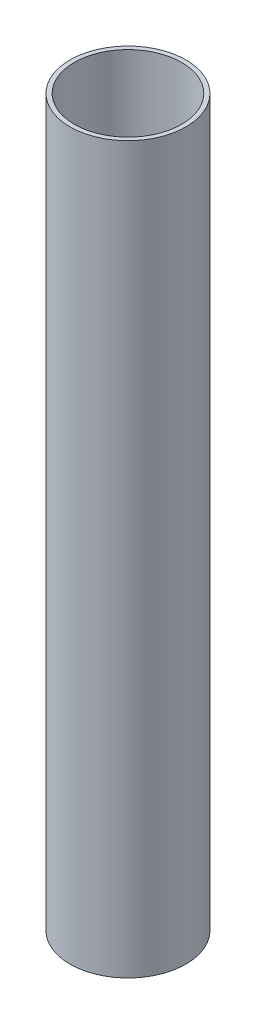
ISO-10303-21;
HEADER;
FILE_DESCRIPTION(('STEP AP214'),'2;1');
FILE_NAME('part.step','',(''),(''),'','','');
FILE_SCHEMA(('AUTOMOTIVE_DESIGN { 1 0 10303 214 1 1 1 1 }'));
ENDSEC;
DATA;
#1=APPLICATION_CONTEXT('core data for automotive mechanical design processes');
#2=APPLICATION_PROTOCOL_DEFINITION('international standard','automotive_design',2000,#1);
#3=PRODUCT_CONTEXT('',#1,'mechanical');
#4=PRODUCT('Part','Part','',(#3));
#5=PRODUCT_RELATED_PRODUCT_CATEGORY('part','',(#4));
#6=PRODUCT_DEFINITION_FORMATION('','',#4);
#7=PRODUCT_DEFINITION_CONTEXT('part definition',#1,'design');
#8=PRODUCT_DEFINITION('design','',#6,#7);
#9=PRODUCT_DEFINITION_SHAPE('','',#8);
#10=(LENGTH_UNIT() NAMED_UNIT(*) SI_UNIT(.MILLI.,.METRE.));
#11=(NAMED_UNIT(*) PLANE_ANGLE_UNIT() SI_UNIT($,.RADIAN.));
#12=(NAMED_UNIT(*) SI_UNIT($,.STERADIAN.) SOLID_ANGLE_UNIT());
#13=UNCERTAINTY_MEASURE_WITH_UNIT(LENGTH_MEASURE(1.E-05),#10,'distance_accuracy_value','');
#14=(GEOMETRIC_REPRESENTATION_CONTEXT(3) GLOBAL_UNCERTAINTY_ASSIGNED_CONTEXT((#13)) GLOBAL_UNIT_ASSIGNED_CONTEXT((#10,
#11,#12)) REPRESENTATION_CONTEXT('',''));
#15=CARTESIAN_POINT('',(0.,0.,0.));
#16=DIRECTION('',(0.,0.,1.));
#17=DIRECTION('',(1.,0.,0.));
#18=AXIS2_PLACEMENT_3D('',#15,#16,#17);
#19=CARTESIAN_POINT('',(0.,200.,0.));
#20=DIRECTION('',(0.,1.,0.));
#21=DIRECTION('',(0.,0.,1.));
#22=AXIS2_PLACEMENT_3D('',#19,#20,#21);
#23=PLANE('',#22);
#24=CARTESIAN_POINT('',(0.,200.,0.));
#25=DIRECTION('',(0.,1.,0.));
#26=DIRECTION('',(0.,0.,1.));
#27=AXIS2_PLACEMENT_3D('',#24,#25,#26);
#28=CIRCLE('',#27,16.);
#29=CARTESIAN_POINT('',(0.,200.,16.));
#30=VERTEX_POINT('',#29);
#31=EDGE_CURVE('E12',#30,#30,#28,.T.);
#32=ORIENTED_EDGE('',*,*,#31,.T.);
#33=EDGE_LOOP('',(#32));
#34=FACE_BOUND('',#33,.T.);
#35=CARTESIAN_POINT('',(0.,200.,0.));
#36=DIRECTION('',(0.,1.,0.));
#37=DIRECTION('',(0.,0.,1.));
#38=AXIS2_PLACEMENT_3D('',#35,#36,#37);
#39=CIRCLE('',#38,14.8);
#40=CARTESIAN_POINT('',(0.,200.,14.8));
#41=VERTEX_POINT('',#40);
#42=EDGE_CURVE('E51',#41,#41,#39,.T.);
#43=ORIENTED_EDGE('',*,*,#42,.F.);
#44=EDGE_LOOP('',(#43));
#45=FACE_BOUND('',#44,.T.);
#46=ADVANCED_FACE('F40',(#34,#45),#23,.T.);
#47=CARTESIAN_POINT('',(0.,0.,0.));
#48=DIRECTION('',(0.,1.,0.));
#49=DIRECTION('',(0.,0.,1.));
#50=AXIS2_PLACEMENT_3D('',#47,#48,#49);
#51=PLANE('',#50);
#52=CARTESIAN_POINT('',(0.,0.,0.));
#53=DIRECTION('',(0.,1.,0.));
#54=DIRECTION('',(0.,0.,1.));
#55=AXIS2_PLACEMENT_3D('',#52,#53,#54);
#56=CIRCLE('',#55,16.);
#57=CARTESIAN_POINT('',(0.,0.,16.));
#58=VERTEX_POINT('',#57);
#59=EDGE_CURVE('E44',#58,#58,#56,.T.);
#60=ORIENTED_EDGE('',*,*,#59,.F.);
#61=EDGE_LOOP('',(#60));
#62=FACE_BOUND('',#61,.T.);
#63=CARTESIAN_POINT('',(0.,0.,0.));
#64=DIRECTION('',(0.,1.,0.));
#65=DIRECTION('',(0.,0.,1.));
#66=AXIS2_PLACEMENT_3D('',#63,#64,#65);
#67=CIRCLE('',#66,14.8);
#68=CARTESIAN_POINT('',(0.,0.,14.8));
#69=VERTEX_POINT('',#68);
#70=EDGE_CURVE('E53',#69,#69,#67,.T.);
#71=ORIENTED_EDGE('',*,*,#70,.T.);
#72=EDGE_LOOP('',(#71));
#73=FACE_BOUND('',#72,.T.);
#74=ADVANCED_FACE('F63',(#62,#73),#51,.F.);
#75=CARTESIAN_POINT('',(0.,200.,0.));
#76=DIRECTION('',(0.,-1.,0.));
#77=DIRECTION('',(0.,0.,-1.));
#78=AXIS2_PLACEMENT_3D('',#75,#76,#77);
#79=CYLINDRICAL_SURFACE('',#78,16.);
#80=ORIENTED_EDGE('',*,*,#31,.F.);
#81=EDGE_LOOP('',(#80));
#82=FACE_BOUND('',#81,.T.);
#83=ORIENTED_EDGE('',*,*,#59,.T.);
#84=EDGE_LOOP('',(#83));
#85=FACE_BOUND('',#84,.T.);
#86=ADVANCED_FACE('F42',(#82,#85),#79,.T.);
#87=CARTESIAN_POINT('',(0.,200.,0.));
#88=DIRECTION('',(0.,-1.,0.));
#89=DIRECTION('',(0.,0.,-1.));
#90=AXIS2_PLACEMENT_3D('',#87,#88,#89);
#91=CYLINDRICAL_SURFACE('',#90,14.8);
#92=ORIENTED_EDGE('',*,*,#42,.T.);
#93=EDGE_LOOP('',(#92));
#94=FACE_BOUND('',#93,.T.);
#95=ORIENTED_EDGE('',*,*,#70,.F.);
#96=EDGE_LOOP('',(#95));
#97=FACE_BOUND('',#96,.T.);
#98=ADVANCED_FACE('F59',(#94,#97),#91,.F.);
#99=CLOSED_SHELL('',(#46,#74,#86,#98));
#100=MANIFOLD_SOLID_BREP('B2',#99);
#101=ADVANCED_BREP_SHAPE_REPRESENTATION('',(#18,#100),#14);
#102=SHAPE_DEFINITION_REPRESENTATION(#9,#101);
ENDSEC;
END-ISO-10303-21;
